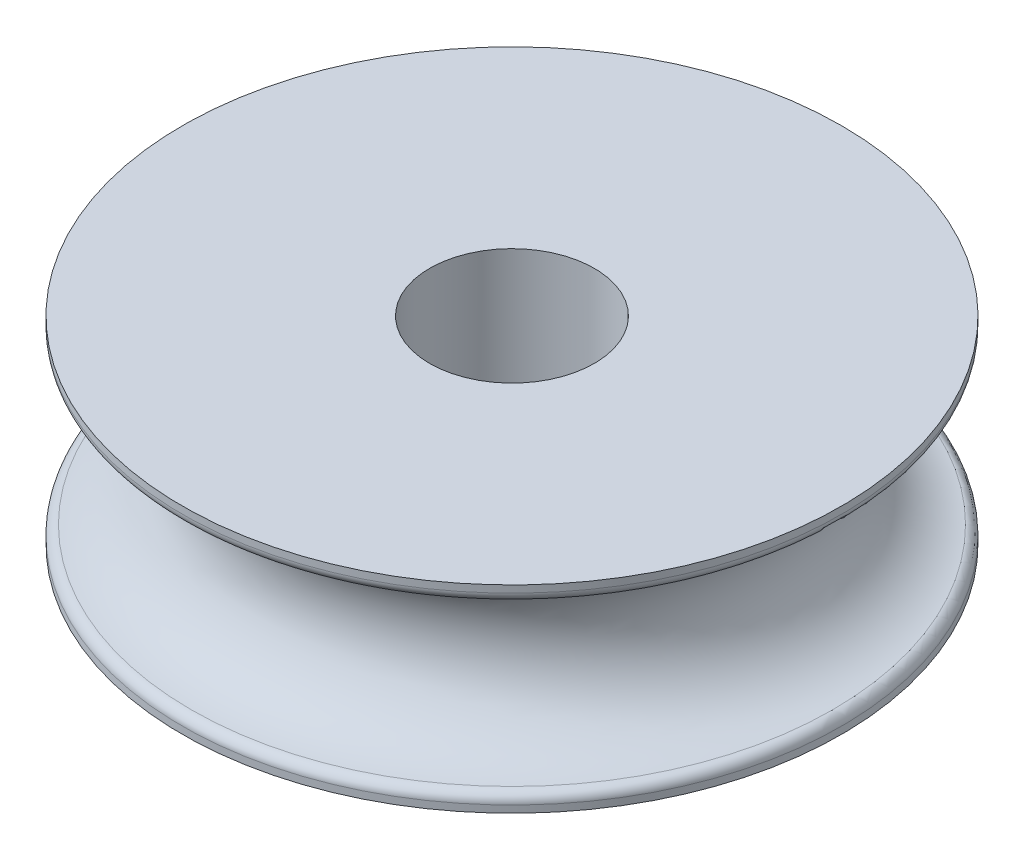
ISO-10303-21;
HEADER;
FILE_DESCRIPTION(('STEP AP214'),'2;1');
FILE_NAME('part.step','',(''),(''),'','','');
FILE_SCHEMA(('AUTOMOTIVE_DESIGN { 1 0 10303 214 1 1 1 1 }'));
ENDSEC;
DATA;
#1=APPLICATION_CONTEXT('core data for automotive mechanical design processes');
#2=APPLICATION_PROTOCOL_DEFINITION('international standard','automotive_design',2000,#1);
#3=PRODUCT_CONTEXT('',#1,'mechanical');
#4=PRODUCT('Part','Part','',(#3));
#5=PRODUCT_RELATED_PRODUCT_CATEGORY('part','',(#4));
#6=PRODUCT_DEFINITION_FORMATION('','',#4);
#7=PRODUCT_DEFINITION_CONTEXT('part definition',#1,'design');
#8=PRODUCT_DEFINITION('design','',#6,#7);
#9=PRODUCT_DEFINITION_SHAPE('','',#8);
#10=(LENGTH_UNIT() NAMED_UNIT(*) SI_UNIT(.MILLI.,.METRE.));
#11=(NAMED_UNIT(*) PLANE_ANGLE_UNIT() SI_UNIT($,.RADIAN.));
#12=(NAMED_UNIT(*) SI_UNIT($,.STERADIAN.) SOLID_ANGLE_UNIT());
#13=UNCERTAINTY_MEASURE_WITH_UNIT(LENGTH_MEASURE(1.E-05),#10,'distance_accuracy_value','');
#14=(GEOMETRIC_REPRESENTATION_CONTEXT(3) GLOBAL_UNCERTAINTY_ASSIGNED_CONTEXT((#13)) GLOBAL_UNIT_ASSIGNED_CONTEXT((#10,
#11,#12)) REPRESENTATION_CONTEXT('',''));
#15=CARTESIAN_POINT('',(0.,0.,0.));
#16=DIRECTION('',(0.,0.,1.));
#17=DIRECTION('',(1.,0.,0.));
#18=AXIS2_PLACEMENT_3D('',#15,#16,#17);
#19=CARTESIAN_POINT('',(0.,0.,0.));
#20=DIRECTION('',(0.,-1.,0.));
#21=DIRECTION('',(0.,0.,-1.));
#22=AXIS2_PLACEMENT_3D('',#19,#20,#21);
#23=PLANE('',#22);
#24=CARTESIAN_POINT('',(0.,0.,0.));
#25=DIRECTION('',(0.,-1.,0.));
#26=DIRECTION('',(0.,0.,-1.));
#27=AXIS2_PLACEMENT_3D('',#24,#25,#26);
#28=CIRCLE('',#27,2.5);
#29=CARTESIAN_POINT('',(0.,0.,-2.5));
#30=VERTEX_POINT('',#29);
#31=EDGE_CURVE('E56',#30,#30,#28,.T.);
#32=ORIENTED_EDGE('',*,*,#31,.F.);
#33=EDGE_LOOP('',(#32));
#34=FACE_BOUND('',#33,.T.);
#35=CARTESIAN_POINT('',(0.,0.,0.));
#36=DIRECTION('',(0.,-1.,0.));
#37=DIRECTION('',(0.,0.,-1.));
#38=AXIS2_PLACEMENT_3D('',#35,#36,#37);
#39=CIRCLE('',#38,10.);
#40=CARTESIAN_POINT('',(0.,0.,-10.));
#41=VERTEX_POINT('',#40);
#42=EDGE_CURVE('E10',#41,#41,#39,.T.);
#43=ORIENTED_EDGE('',*,*,#42,.T.);
#44=EDGE_LOOP('',(#43));
#45=FACE_BOUND('',#44,.T.);
#46=ADVANCED_FACE('F31',(#34,#45),#23,.T.);
#47=CARTESIAN_POINT('',(0.,0.,0.));
#48=DIRECTION('',(0.,-1.,0.));
#49=DIRECTION('',(0.,0.,-1.));
#50=AXIS2_PLACEMENT_3D('',#47,#48,#49);
#51=CYLINDRICAL_SURFACE('',#50,10.);
#52=CARTESIAN_POINT('',(0.,0.216117818584989,0.));
#53=DIRECTION('',(0.,-1.,0.));
#54=DIRECTION('',(0.,0.,-1.));
#55=AXIS2_PLACEMENT_3D('',#52,#53,#54);
#56=CIRCLE('',#55,10.);
#57=CARTESIAN_POINT('',(0.,0.216117818584989,-10.));
#58=VERTEX_POINT('',#57);
#59=EDGE_CURVE('E37',#58,#58,#56,.T.);
#60=ORIENTED_EDGE('',*,*,#59,.T.);
#61=EDGE_LOOP('',(#60));
#62=FACE_BOUND('',#61,.T.);
#63=ORIENTED_EDGE('',*,*,#42,.F.);
#64=EDGE_LOOP('',(#63));
#65=FACE_BOUND('',#64,.T.);
#66=ADVANCED_FACE('F92',(#62,#65),#51,.T.);
#67=CARTESIAN_POINT('',(0.,0.216117818584989,0.));
#68=DIRECTION('',(0.,-1.,0.));
#69=DIRECTION('',(0.,0.,-1.));
#70=AXIS2_PLACEMENT_3D('',#67,#68,#69);
#71=TOROIDAL_SURFACE('',#70,9.7,0.300000000000001);
#72=CARTESIAN_POINT('',(0.,0.514390909450884,0.));
#73=DIRECTION('',(0.,-1.,0.));
#74=DIRECTION('',(0.,0.,-1.));
#75=AXIS2_PLACEMENT_3D('',#72,#73,#74);
#76=CIRCLE('',#75,9.73214285714286);
#77=CARTESIAN_POINT('',(0.,0.514390909450884,-9.73214285714286));
#78=VERTEX_POINT('',#77);
#79=EDGE_CURVE('E41',#78,#78,#76,.T.);
#80=ORIENTED_EDGE('',*,*,#79,.T.);
#81=EDGE_LOOP('',(#80));
#82=FACE_BOUND('',#81,.T.);
#83=ORIENTED_EDGE('',*,*,#59,.F.);
#84=EDGE_LOOP('',(#83));
#85=FACE_BOUND('',#84,.T.);
#86=ADVANCED_FACE('F86',(#82,#85),#71,.T.);
#87=CARTESIAN_POINT('',(0.,3.,0.));
#88=DIRECTION('',(0.,-1.,0.));
#89=DIRECTION('',(0.,0.,-1.));
#90=AXIS2_PLACEMENT_3D('',#87,#88,#89);
#91=TOROIDAL_SURFACE('',#90,10.,2.5);
#92=CARTESIAN_POINT('',(0.,5.48560909054912,0.));
#93=DIRECTION('',(0.,-1.,0.));
#94=DIRECTION('',(0.,0.,-1.));
#95=AXIS2_PLACEMENT_3D('',#92,#93,#94);
#96=CIRCLE('',#95,9.73214285714286);
#97=CARTESIAN_POINT('',(0.,5.48560909054912,-9.73214285714286));
#98=VERTEX_POINT('',#97);
#99=EDGE_CURVE('E45',#98,#98,#96,.T.);
#100=ORIENTED_EDGE('',*,*,#99,.T.);
#101=EDGE_LOOP('',(#100));
#102=FACE_BOUND('',#101,.T.);
#103=ORIENTED_EDGE('',*,*,#79,.F.);
#104=EDGE_LOOP('',(#103));
#105=FACE_BOUND('',#104,.T.);
#106=ADVANCED_FACE('F80',(#102,#105),#91,.F.);
#107=CARTESIAN_POINT('',(0.,5.78388218141501,0.));
#108=DIRECTION('',(0.,-1.,0.));
#109=DIRECTION('',(0.,0.,-1.));
#110=AXIS2_PLACEMENT_3D('',#107,#108,#109);
#111=TOROIDAL_SURFACE('',#110,9.7,0.3);
#112=CARTESIAN_POINT('',(0.,5.78388218141501,0.));
#113=DIRECTION('',(0.,-1.,0.));
#114=DIRECTION('',(0.,0.,-1.));
#115=AXIS2_PLACEMENT_3D('',#112,#113,#114);
#116=CIRCLE('',#115,10.);
#117=CARTESIAN_POINT('',(0.,5.78388218141501,-10.));
#118=VERTEX_POINT('',#117);
#119=EDGE_CURVE('E50',#118,#118,#116,.T.);
#120=ORIENTED_EDGE('',*,*,#119,.T.);
#121=EDGE_LOOP('',(#120));
#122=FACE_BOUND('',#121,.T.);
#123=ORIENTED_EDGE('',*,*,#99,.F.);
#124=EDGE_LOOP('',(#123));
#125=FACE_BOUND('',#124,.T.);
#126=ADVANCED_FACE('F74',(#122,#125),#111,.T.);
#127=CARTESIAN_POINT('',(0.,0.,0.));
#128=DIRECTION('',(0.,-1.,0.));
#129=DIRECTION('',(0.,0.,-1.));
#130=AXIS2_PLACEMENT_3D('',#127,#128,#129);
#131=CYLINDRICAL_SURFACE('',#130,10.);
#132=CARTESIAN_POINT('',(0.,6.,0.));
#133=DIRECTION('',(0.,-1.,0.));
#134=DIRECTION('',(0.,0.,-1.));
#135=AXIS2_PLACEMENT_3D('',#132,#133,#134);
#136=CIRCLE('',#135,10.);
#137=CARTESIAN_POINT('',(0.,6.,-10.));
#138=VERTEX_POINT('',#137);
#139=EDGE_CURVE('E53',#138,#138,#136,.T.);
#140=ORIENTED_EDGE('',*,*,#139,.T.);
#141=EDGE_LOOP('',(#140));
#142=FACE_BOUND('',#141,.T.);
#143=ORIENTED_EDGE('',*,*,#119,.F.);
#144=EDGE_LOOP('',(#143));
#145=FACE_BOUND('',#144,.T.);
#146=ADVANCED_FACE('F68',(#142,#145),#131,.T.);
#147=CARTESIAN_POINT('',(10.,6.,0.));
#148=DIRECTION('',(0.,1.,0.));
#149=DIRECTION('',(0.,0.,1.));
#150=AXIS2_PLACEMENT_3D('',#147,#148,#149);
#151=PLANE('',#150);
#152=CARTESIAN_POINT('',(0.,6.,0.));
#153=DIRECTION('',(0.,1.,0.));
#154=DIRECTION('',(0.,0.,1.));
#155=AXIS2_PLACEMENT_3D('',#152,#153,#154);
#156=CIRCLE('',#155,2.5);
#157=CARTESIAN_POINT('',(0.,6.,2.5));
#158=VERTEX_POINT('',#157);
#159=EDGE_CURVE('E59',#158,#158,#156,.T.);
#160=ORIENTED_EDGE('',*,*,#159,.F.);
#161=EDGE_LOOP('',(#160));
#162=FACE_BOUND('',#161,.T.);
#163=ORIENTED_EDGE('',*,*,#139,.F.);
#164=EDGE_LOOP('',(#163));
#165=FACE_BOUND('',#164,.T.);
#166=ADVANCED_FACE('F65',(#162,#165),#151,.T.);
#167=CARTESIAN_POINT('',(0.,-4.,0.));
#168=DIRECTION('',(0.,1.,0.));
#169=DIRECTION('',(0.,0.,1.));
#170=AXIS2_PLACEMENT_3D('',#167,#168,#169);
#171=CYLINDRICAL_SURFACE('',#170,2.5);
#172=ORIENTED_EDGE('',*,*,#31,.T.);
#173=EDGE_LOOP('',(#172));
#174=FACE_BOUND('',#173,.T.);
#175=ORIENTED_EDGE('',*,*,#159,.T.);
#176=EDGE_LOOP('',(#175));
#177=FACE_BOUND('',#176,.T.);
#178=ADVANCED_FACE('F63',(#174,#177),#171,.F.);
#179=CLOSED_SHELL('',(#46,#66,#86,#106,#126,#146,#166,#178));
#180=MANIFOLD_SOLID_BREP('B2',#179);
#181=ADVANCED_BREP_SHAPE_REPRESENTATION('',(#18,#180),#14);
#182=SHAPE_DEFINITION_REPRESENTATION(#9,#181);
ENDSEC;
END-ISO-10303-21;
